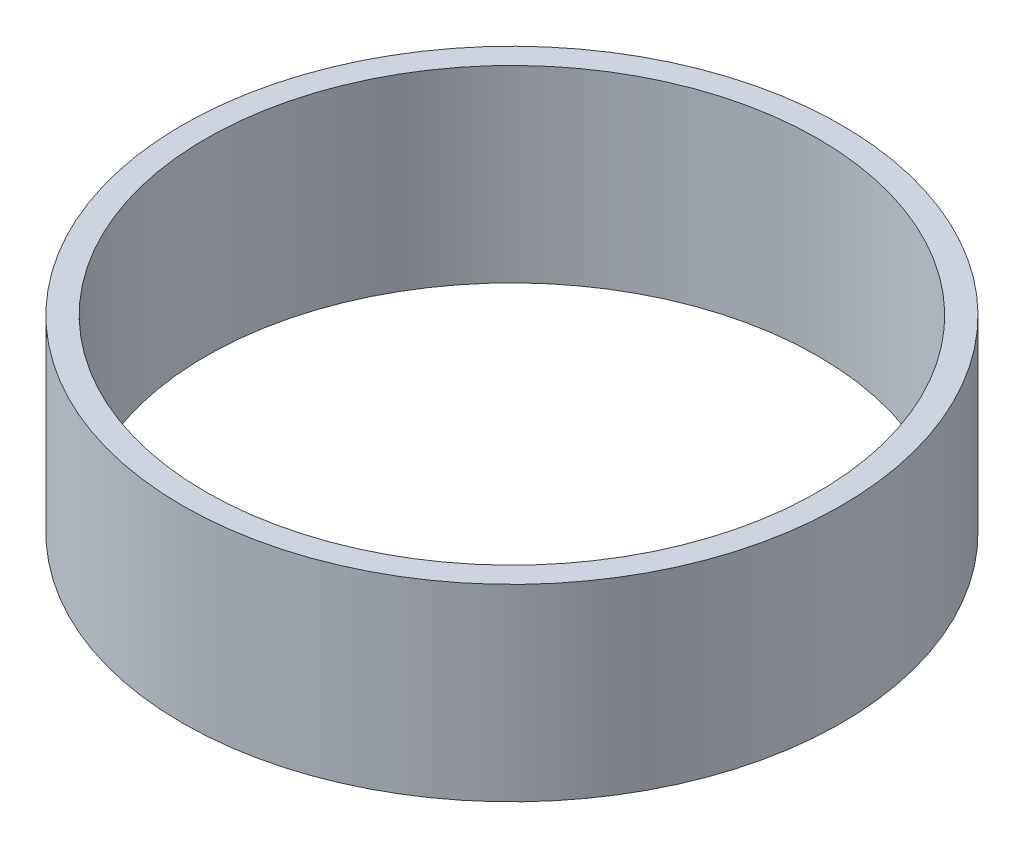
ISO-10303-21;
HEADER;
FILE_DESCRIPTION(('STEP AP214'),'2;1');
FILE_NAME('part.step','',(''),(''),'','','');
FILE_SCHEMA(('AUTOMOTIVE_DESIGN { 1 0 10303 214 1 1 1 1 }'));
ENDSEC;
DATA;
#1=APPLICATION_CONTEXT('core data for automotive mechanical design processes');
#2=APPLICATION_PROTOCOL_DEFINITION('international standard','automotive_design',2000,#1);
#3=PRODUCT_CONTEXT('',#1,'mechanical');
#4=PRODUCT('Part','Part','',(#3));
#5=PRODUCT_RELATED_PRODUCT_CATEGORY('part','',(#4));
#6=PRODUCT_DEFINITION_FORMATION('','',#4);
#7=PRODUCT_DEFINITION_CONTEXT('part definition',#1,'design');
#8=PRODUCT_DEFINITION('design','',#6,#7);
#9=PRODUCT_DEFINITION_SHAPE('','',#8);
#10=(LENGTH_UNIT() NAMED_UNIT(*) SI_UNIT(.MILLI.,.METRE.));
#11=(NAMED_UNIT(*) PLANE_ANGLE_UNIT() SI_UNIT($,.RADIAN.));
#12=(NAMED_UNIT(*) SI_UNIT($,.STERADIAN.) SOLID_ANGLE_UNIT());
#13=UNCERTAINTY_MEASURE_WITH_UNIT(LENGTH_MEASURE(1.E-05),#10,'distance_accuracy_value','');
#14=(GEOMETRIC_REPRESENTATION_CONTEXT(3) GLOBAL_UNCERTAINTY_ASSIGNED_CONTEXT((#13)) GLOBAL_UNIT_ASSIGNED_CONTEXT((#10,
#11,#12)) REPRESENTATION_CONTEXT('',''));
#15=CARTESIAN_POINT('',(0.,0.,0.));
#16=DIRECTION('',(0.,0.,1.));
#17=DIRECTION('',(1.,0.,0.));
#18=AXIS2_PLACEMENT_3D('',#15,#16,#17);
#19=CARTESIAN_POINT('',(0.,4.,0.));
#20=DIRECTION('',(0.,1.,0.));
#21=DIRECTION('',(0.,0.,1.));
#22=AXIS2_PLACEMENT_3D('',#19,#20,#21);
#23=PLANE('',#22);
#24=CARTESIAN_POINT('',(0.,4.,0.));
#25=DIRECTION('',(0.,1.,0.));
#26=DIRECTION('',(0.,0.,1.));
#27=AXIS2_PLACEMENT_3D('',#24,#25,#26);
#28=CIRCLE('',#27,7.);
#29=CARTESIAN_POINT('',(0.,4.,7.));
#30=VERTEX_POINT('',#29);
#31=EDGE_CURVE('E10',#30,#30,#28,.T.);
#32=ORIENTED_EDGE('',*,*,#31,.T.);
#33=EDGE_LOOP('',(#32));
#34=FACE_BOUND('',#33,.T.);
#35=CARTESIAN_POINT('',(0.,4.,0.));
#36=DIRECTION('',(0.,1.,0.));
#37=DIRECTION('',(0.,0.,1.));
#38=AXIS2_PLACEMENT_3D('',#35,#36,#37);
#39=CIRCLE('',#38,6.5);
#40=CARTESIAN_POINT('',(0.,4.,6.5));
#41=VERTEX_POINT('',#40);
#42=EDGE_CURVE('E50',#41,#41,#39,.T.);
#43=ORIENTED_EDGE('',*,*,#42,.F.);
#44=EDGE_LOOP('',(#43));
#45=FACE_BOUND('',#44,.T.);
#46=ADVANCED_FACE('F37',(#34,#45),#23,.T.);
#47=CARTESIAN_POINT('',(0.,0.,0.));
#48=DIRECTION('',(0.,1.,0.));
#49=DIRECTION('',(0.,0.,1.));
#50=AXIS2_PLACEMENT_3D('',#47,#48,#49);
#51=PLANE('',#50);
#52=CARTESIAN_POINT('',(0.,0.,0.));
#53=DIRECTION('',(0.,1.,0.));
#54=DIRECTION('',(0.,0.,1.));
#55=AXIS2_PLACEMENT_3D('',#52,#53,#54);
#56=CIRCLE('',#55,7.);
#57=CARTESIAN_POINT('',(0.,0.,7.));
#58=VERTEX_POINT('',#57);
#59=EDGE_CURVE('E41',#58,#58,#56,.T.);
#60=ORIENTED_EDGE('',*,*,#59,.F.);
#61=EDGE_LOOP('',(#60));
#62=FACE_BOUND('',#61,.T.);
#63=CARTESIAN_POINT('',(0.,0.,0.));
#64=DIRECTION('',(0.,1.,0.));
#65=DIRECTION('',(0.,0.,1.));
#66=AXIS2_PLACEMENT_3D('',#63,#64,#65);
#67=CIRCLE('',#66,6.5);
#68=CARTESIAN_POINT('',(0.,0.,6.5));
#69=VERTEX_POINT('',#68);
#70=EDGE_CURVE('E52',#69,#69,#67,.T.);
#71=ORIENTED_EDGE('',*,*,#70,.T.);
#72=EDGE_LOOP('',(#71));
#73=FACE_BOUND('',#72,.T.);
#74=ADVANCED_FACE('F64',(#62,#73),#51,.F.);
#75=CARTESIAN_POINT('',(0.,4.,0.));
#76=DIRECTION('',(0.,-1.,0.));
#77=DIRECTION('',(0.,0.,-1.));
#78=AXIS2_PLACEMENT_3D('',#75,#76,#77);
#79=CYLINDRICAL_SURFACE('',#78,7.);
#80=ORIENTED_EDGE('',*,*,#31,.F.);
#81=EDGE_LOOP('',(#80));
#82=FACE_BOUND('',#81,.T.);
#83=ORIENTED_EDGE('',*,*,#59,.T.);
#84=EDGE_LOOP('',(#83));
#85=FACE_BOUND('',#84,.T.);
#86=ADVANCED_FACE('F39',(#82,#85),#79,.T.);
#87=CARTESIAN_POINT('',(0.,4.,0.));
#88=DIRECTION('',(0.,-1.,0.));
#89=DIRECTION('',(0.,0.,-1.));
#90=AXIS2_PLACEMENT_3D('',#87,#88,#89);
#91=CYLINDRICAL_SURFACE('',#90,6.5);
#92=ORIENTED_EDGE('',*,*,#42,.T.);
#93=EDGE_LOOP('',(#92));
#94=FACE_BOUND('',#93,.T.);
#95=ORIENTED_EDGE('',*,*,#70,.F.);
#96=EDGE_LOOP('',(#95));
#97=FACE_BOUND('',#96,.T.);
#98=ADVANCED_FACE('F60',(#94,#97),#91,.F.);
#99=CLOSED_SHELL('',(#46,#74,#86,#98));
#100=MANIFOLD_SOLID_BREP('B2',#99);
#101=ADVANCED_BREP_SHAPE_REPRESENTATION('',(#18,#100),#14);
#102=SHAPE_DEFINITION_REPRESENTATION(#9,#101);
ENDSEC;
END-ISO-10303-21;
